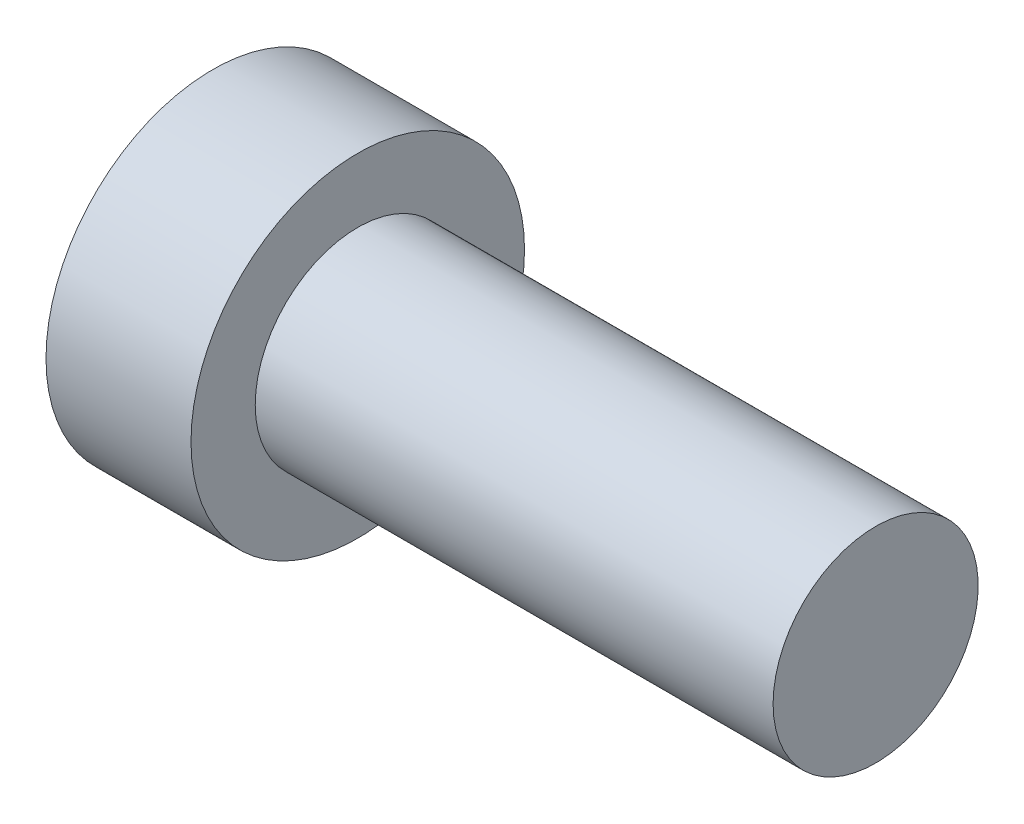
ISO-10303-21;
HEADER;
FILE_DESCRIPTION(('STEP AP214'),'2;1');
FILE_NAME('part.step','',(''),(''),'','','');
FILE_SCHEMA(('AUTOMOTIVE_DESIGN { 1 0 10303 214 1 1 1 1 }'));
ENDSEC;
DATA;
#1=APPLICATION_CONTEXT('core data for automotive mechanical design processes');
#2=APPLICATION_PROTOCOL_DEFINITION('international standard','automotive_design',2000,#1);
#3=PRODUCT_CONTEXT('',#1,'mechanical');
#4=PRODUCT('Part','Part','',(#3));
#5=PRODUCT_RELATED_PRODUCT_CATEGORY('part','',(#4));
#6=PRODUCT_DEFINITION_FORMATION('','',#4);
#7=PRODUCT_DEFINITION_CONTEXT('part definition',#1,'design');
#8=PRODUCT_DEFINITION('design','',#6,#7);
#9=PRODUCT_DEFINITION_SHAPE('','',#8);
#10=(LENGTH_UNIT() NAMED_UNIT(*) SI_UNIT(.MILLI.,.METRE.));
#11=(NAMED_UNIT(*) PLANE_ANGLE_UNIT() SI_UNIT($,.RADIAN.));
#12=(NAMED_UNIT(*) SI_UNIT($,.STERADIAN.) SOLID_ANGLE_UNIT());
#13=UNCERTAINTY_MEASURE_WITH_UNIT(LENGTH_MEASURE(1.E-05),#10,'distance_accuracy_value','');
#14=(GEOMETRIC_REPRESENTATION_CONTEXT(3) GLOBAL_UNCERTAINTY_ASSIGNED_CONTEXT((#13)) GLOBAL_UNIT_ASSIGNED_CONTEXT((#10,
#11,#12)) REPRESENTATION_CONTEXT('',''));
#15=CARTESIAN_POINT('',(0.,0.,0.));
#16=DIRECTION('',(0.,0.,1.));
#17=DIRECTION('',(1.,0.,0.));
#18=AXIS2_PLACEMENT_3D('',#15,#16,#17);
#19=CARTESIAN_POINT('',(3.609467,0.,0.));
#20=DIRECTION('',(-1.,0.,0.));
#21=DIRECTION('',(0.,1.,0.));
#22=AXIS2_PLACEMENT_3D('',#19,#20,#21);
#23=SPHERICAL_SURFACE('',#22,3.609467);
#24=CARTESIAN_POINT('',(0.635,0.,0.));
#25=DIRECTION('',(-1.,0.,0.));
#26=DIRECTION('',(0.,0.,1.));
#27=AXIS2_PLACEMENT_3D('',#24,#25,#26);
#28=CIRCLE('',#27,2.0447);
#29=CARTESIAN_POINT('',(0.635,0.,2.0447));
#30=VERTEX_POINT('',#29);
#31=EDGE_CURVE('E151',#30,#30,#28,.T.);
#32=ORIENTED_EDGE('',*,*,#31,.T.);
#33=EDGE_LOOP('',(#32));
#34=FACE_BOUND('',#33,.T.);
#35=CARTESIAN_POINT('',(3.60739848397723,0.,-0.0205319368186015));
#36=DIRECTION('',(-0.100238850281226,0.,-0.994963402791428));
#37=DIRECTION('',(-0.994963402791428,0.,0.100238850281226));
#38=AXIS2_PLACEMENT_3D('',#35,#36,#37);
#39=CIRCLE('',#38,3.60940801031152);
#40=CARTESIAN_POINT('',(0.266177431910129,1.32316213484822,0.316083616934427));
#41=VERTEX_POINT('',#40);
#42=CARTESIAN_POINT('',(0.0321066751463881,0.339665372280027,0.339665372280028));
#43=VERTEX_POINT('',#42);
#44=EDGE_CURVE('E122',#41,#43,#39,.F.);
#45=ORIENTED_EDGE('',*,*,#44,.T.);
#46=CARTESIAN_POINT('',(3.60739848397723,-0.0205319368186018,0.));
#47=DIRECTION('',(-0.100238850281226,-0.994963402791428,0.));
#48=DIRECTION('',(0.994963402791428,-0.100238850281226,0.));
#49=AXIS2_PLACEMENT_3D('',#46,#47,#48);
#50=CIRCLE('',#49,3.60940801031152);
#51=CARTESIAN_POINT('',(0.266177431910129,0.316083616934423,1.32316213484822));
#52=VERTEX_POINT('',#51);
#53=EDGE_CURVE('E104',#43,#52,#50,.F.);
#54=ORIENTED_EDGE('',*,*,#53,.T.);
#55=CARTESIAN_POINT('',(2.94615805138544,0.,-0.826822317342798));
#56=DIRECTION('',(0.625759286857491,0.,0.78001622733864));
#57=DIRECTION('',(0.78001622733864,0.,-0.625759286857491));
#58=AXIS2_PLACEMENT_3D('',#55,#56,#57);
#59=CIRCLE('',#58,3.45030985830559);
#60=CARTESIAN_POINT('',(0.266177431910128,-0.316083616934432,1.32316213484822));
#61=VERTEX_POINT('',#60);
#62=EDGE_CURVE('E115',#61,#52,#59,.F.);
#63=ORIENTED_EDGE('',*,*,#62,.F.);
#64=CARTESIAN_POINT('',(3.60739848397723,0.0205319368186015,0.));
#65=DIRECTION('',(-0.100238850281226,0.994963402791428,0.));
#66=DIRECTION('',(-0.994963402791428,-0.100238850281226,0.));
#67=AXIS2_PLACEMENT_3D('',#64,#65,#66);
#68=CIRCLE('',#67,3.60940801031152);
#69=CARTESIAN_POINT('',(0.0321066751463881,-0.339665372280029,0.339665372280028));
#70=VERTEX_POINT('',#69);
#71=EDGE_CURVE('E184',#61,#70,#68,.F.);
#72=ORIENTED_EDGE('',*,*,#71,.T.);
#73=CARTESIAN_POINT('',(0.266177431910128,-1.32316213484822,0.316083616934427));
#74=VERTEX_POINT('',#73);
#75=EDGE_CURVE('E159',#70,#74,#39,.F.);
#76=ORIENTED_EDGE('',*,*,#75,.T.);
#77=CARTESIAN_POINT('',(2.94615805138544,0.826822317342798,0.));
#78=DIRECTION('',(0.625759286857491,-0.78001622733864,0.));
#79=DIRECTION('',(0.78001622733864,0.625759286857491,0.));
#80=AXIS2_PLACEMENT_3D('',#77,#78,#79);
#81=CIRCLE('',#80,3.45030985830559);
#82=CARTESIAN_POINT('',(0.266177431910128,-1.32316213484822,-0.316083616934428));
#83=VERTEX_POINT('',#82);
#84=EDGE_CURVE('E157',#83,#74,#81,.F.);
#85=ORIENTED_EDGE('',*,*,#84,.F.);
#86=CARTESIAN_POINT('',(3.60739848397723,0.,0.0205319368186018));
#87=DIRECTION('',(-0.100238850281226,0.,0.994963402791428));
#88=DIRECTION('',(0.994963402791428,0.,0.100238850281226));
#89=AXIS2_PLACEMENT_3D('',#86,#87,#88);
#90=CIRCLE('',#89,3.60940801031152);
#91=CARTESIAN_POINT('',(0.0321066751463881,-0.339665372280027,-0.339665372280028));
#92=VERTEX_POINT('',#91);
#93=EDGE_CURVE('E161',#83,#92,#90,.F.);
#94=ORIENTED_EDGE('',*,*,#93,.T.);
#95=CARTESIAN_POINT('',(0.266177431910128,-0.316083616934422,-1.32316213484822));
#96=VERTEX_POINT('',#95);
#97=EDGE_CURVE('E188',#92,#96,#68,.F.);
#98=ORIENTED_EDGE('',*,*,#97,.T.);
#99=CARTESIAN_POINT('',(2.94615805138544,0.,0.826822317342798));
#100=DIRECTION('',(0.625759286857491,0.,-0.78001622733864));
#101=DIRECTION('',(-0.78001622733864,0.,-0.625759286857491));
#102=AXIS2_PLACEMENT_3D('',#99,#100,#101);
#103=CIRCLE('',#102,3.45030985830559);
#104=CARTESIAN_POINT('',(0.266177431910128,0.316083616934432,-1.32316213484822));
#105=VERTEX_POINT('',#104);
#106=EDGE_CURVE('E116',#105,#96,#103,.F.);
#107=ORIENTED_EDGE('',*,*,#106,.F.);
#108=CARTESIAN_POINT('',(0.0321066751463881,0.339665372280029,-0.339665372280028));
#109=VERTEX_POINT('',#108);
#110=EDGE_CURVE('E141',#105,#109,#50,.F.);
#111=ORIENTED_EDGE('',*,*,#110,.T.);
#112=CARTESIAN_POINT('',(0.266177431910129,1.32316213484822,-0.316083616934428));
#113=VERTEX_POINT('',#112);
#114=EDGE_CURVE('E55',#109,#113,#90,.F.);
#115=ORIENTED_EDGE('',*,*,#114,.T.);
#116=CARTESIAN_POINT('',(2.94615805138544,-0.826822317342798,0.));
#117=DIRECTION('',(0.625759286857491,0.78001622733864,0.));
#118=DIRECTION('',(-0.78001622733864,0.625759286857491,0.));
#119=AXIS2_PLACEMENT_3D('',#116,#117,#118);
#120=CIRCLE('',#119,3.45030985830559);
#121=EDGE_CURVE('E40',#41,#113,#120,.F.);
#122=ORIENTED_EDGE('',*,*,#121,.F.);
#123=EDGE_LOOP('',(#45,#54,#63,#72,#76,#85,#94,#98,#107,#111,#115,#122));
#124=FACE_BOUND('',#123,.T.);
#125=ADVANCED_FACE('F32',(#34,#124),#23,.T.);
#126=CARTESIAN_POINT('',(1.91551441860465,0.,-0.149919069767442));
#127=DIRECTION('',(-0.100238850281226,0.,0.994963402791428));
#128=DIRECTION('',(0.994963402791428,0.,0.100238850281226));
#129=AXIS2_PLACEMENT_3D('',#126,#127,#128);
#130=PLANE('',#129);
#131=ORIENTED_EDGE('',*,*,#114,.F.);
#132=DIRECTION('',(0.990002148884809,-0.099739022462276,0.0997390224622756));
#133=VECTOR('',#132,1.);
#134=CARTESIAN_POINT('',(1.93031770438884,0.148427693960826,-0.148427693960825));
#135=LINE('',#134,#133);
#136=CARTESIAN_POINT('',(1.7018,0.171450000000001,-0.171449999999999));
#137=VERTEX_POINT('',#136);
#138=EDGE_CURVE('E166',#109,#137,#135,.T.);
#139=ORIENTED_EDGE('',*,*,#138,.T.);
#140=DIRECTION('',(0.777618868349576,-0.623836032444622,0.0783421994232783));
#141=VECTOR('',#140,1.);
#142=CARTESIAN_POINT('',(0.,1.5367,-0.3429));
#143=LINE('',#142,#141);
#144=EDGE_CURVE('E125',#113,#137,#143,.T.);
#145=ORIENTED_EDGE('',*,*,#144,.F.);
#146=EDGE_LOOP('',(#131,#139,#145));
#147=FACE_BOUND('',#146,.T.);
#148=ADVANCED_FACE('F165',(#147),#130,.T.);
#149=DIRECTION('',(0.777618868349576,0.623836032444622,0.0783421994232783));
#150=VECTOR('',#149,1.);
#151=CARTESIAN_POINT('',(0.,-1.5367,-0.3429));
#152=LINE('',#151,#150);
#153=CARTESIAN_POINT('',(1.7018,-0.17145,-0.17145));
#154=VERTEX_POINT('',#153);
#155=EDGE_CURVE('E47',#83,#154,#152,.T.);
#156=ORIENTED_EDGE('',*,*,#155,.T.);
#157=DIRECTION('',(-0.990002148884809,-0.0997390224622751,-0.0997390224622757));
#158=VECTOR('',#157,1.);
#159=CARTESIAN_POINT('',(1.93031770438884,-0.148427693960825,-0.148427693960825));
#160=LINE('',#159,#158);
#161=EDGE_CURVE('E186',#154,#92,#160,.T.);
#162=ORIENTED_EDGE('',*,*,#161,.T.);
#163=ORIENTED_EDGE('',*,*,#93,.F.);
#164=EDGE_LOOP('',(#156,#162,#163));
#165=FACE_BOUND('',#164,.T.);
#166=ADVANCED_FACE('F210',(#165),#130,.T.);
#167=CARTESIAN_POINT('',(1.91551441860465,0.,0.149919069767442));
#168=DIRECTION('',(-0.100238850281226,0.,-0.994963402791428));
#169=DIRECTION('',(-0.994963402791428,0.,0.100238850281226));
#170=AXIS2_PLACEMENT_3D('',#167,#168,#169);
#171=PLANE('',#170);
#172=DIRECTION('',(0.777618868349576,-0.623836032444622,-0.0783421994232782));
#173=VECTOR('',#172,1.);
#174=CARTESIAN_POINT('',(0.,1.5367,0.3429));
#175=LINE('',#174,#173);
#176=CARTESIAN_POINT('',(1.7018,0.171449999999999,0.171450000000001));
#177=VERTEX_POINT('',#176);
#178=EDGE_CURVE('E120',#41,#177,#175,.T.);
#179=ORIENTED_EDGE('',*,*,#178,.T.);
#180=DIRECTION('',(-0.990002148884809,0.0997390224622753,0.0997390224622755));
#181=VECTOR('',#180,1.);
#182=CARTESIAN_POINT('',(1.93031770438884,0.148427693960825,0.148427693960825));
#183=LINE('',#182,#181);
#184=EDGE_CURVE('E11',#177,#43,#183,.T.);
#185=ORIENTED_EDGE('',*,*,#184,.T.);
#186=ORIENTED_EDGE('',*,*,#44,.F.);
#187=EDGE_LOOP('',(#179,#185,#186));
#188=FACE_BOUND('',#187,.T.);
#189=ADVANCED_FACE('F121',(#188),#171,.T.);
#190=ORIENTED_EDGE('',*,*,#75,.F.);
#191=DIRECTION('',(0.990002148884809,0.0997390224622758,-0.0997390224622755));
#192=VECTOR('',#191,1.);
#193=CARTESIAN_POINT('',(1.93031770438884,-0.148427693960826,0.148427693960825));
#194=LINE('',#193,#192);
#195=CARTESIAN_POINT('',(1.7018,-0.17145,0.17145));
#196=VERTEX_POINT('',#195);
#197=EDGE_CURVE('E181',#70,#196,#194,.T.);
#198=ORIENTED_EDGE('',*,*,#197,.T.);
#199=DIRECTION('',(0.777618868349576,0.623836032444622,-0.0783421994232781));
#200=VECTOR('',#199,1.);
#201=CARTESIAN_POINT('',(0.,-1.5367,0.3429));
#202=LINE('',#201,#200);
#203=EDGE_CURVE('E172',#74,#196,#202,.T.);
#204=ORIENTED_EDGE('',*,*,#203,.F.);
#205=EDGE_LOOP('',(#190,#198,#204));
#206=FACE_BOUND('',#205,.T.);
#207=ADVANCED_FACE('F180',(#206),#171,.T.);
#208=CARTESIAN_POINT('',(-25.4,0.,0.));
#209=DIRECTION('',(-1.,0.,0.));
#210=DIRECTION('',(0.,0.,1.));
#211=AXIS2_PLACEMENT_3D('',#208,#209,#210);
#212=CYLINDRICAL_SURFACE('',#211,1.2573);
#213=CARTESIAN_POINT('',(8.763,0.,0.));
#214=DIRECTION('',(-1.,0.,0.));
#215=DIRECTION('',(0.,0.,1.));
#216=AXIS2_PLACEMENT_3D('',#213,#214,#215);
#217=CIRCLE('',#216,1.2573);
#218=CARTESIAN_POINT('',(8.763,0.,1.2573));
#219=VERTEX_POINT('',#218);
#220=EDGE_CURVE('E154',#219,#219,#217,.T.);
#221=ORIENTED_EDGE('',*,*,#220,.T.);
#222=EDGE_LOOP('',(#221));
#223=FACE_BOUND('',#222,.T.);
#224=CARTESIAN_POINT('',(2.413,0.,0.));
#225=DIRECTION('',(-1.,0.,0.));
#226=DIRECTION('',(0.,0.,1.));
#227=AXIS2_PLACEMENT_3D('',#224,#225,#226);
#228=CIRCLE('',#227,1.2573);
#229=CARTESIAN_POINT('',(2.413,0.,1.2573));
#230=VERTEX_POINT('',#229);
#231=EDGE_CURVE('E145',#230,#230,#228,.T.);
#232=ORIENTED_EDGE('',*,*,#231,.F.);
#233=EDGE_LOOP('',(#232));
#234=FACE_BOUND('',#233,.T.);
#235=ADVANCED_FACE('F34',(#223,#234),#212,.T.);
#236=CARTESIAN_POINT('',(8.763,1.2573,0.));
#237=DIRECTION('',(1.,0.,0.));
#238=DIRECTION('',(0.,0.,-1.));
#239=AXIS2_PLACEMENT_3D('',#236,#237,#238);
#240=PLANE('',#239);
#241=ORIENTED_EDGE('',*,*,#220,.F.);
#242=EDGE_LOOP('',(#241));
#243=FACE_BOUND('',#242,.T.);
#244=ADVANCED_FACE('F232',(#243),#240,.T.);
#245=CARTESIAN_POINT('',(-25.4,0.,0.));
#246=DIRECTION('',(-1.,0.,0.));
#247=DIRECTION('',(0.,0.,1.));
#248=AXIS2_PLACEMENT_3D('',#245,#246,#247);
#249=CYLINDRICAL_SURFACE('',#248,2.0447);
#250=ORIENTED_EDGE('',*,*,#31,.F.);
#251=EDGE_LOOP('',(#250));
#252=FACE_BOUND('',#251,.T.);
#253=CARTESIAN_POINT('',(2.413,0.,0.));
#254=DIRECTION('',(-1.,0.,0.));
#255=DIRECTION('',(0.,0.,1.));
#256=AXIS2_PLACEMENT_3D('',#253,#254,#255);
#257=CIRCLE('',#256,2.0447);
#258=CARTESIAN_POINT('',(2.413,0.,2.0447));
#259=VERTEX_POINT('',#258);
#260=EDGE_CURVE('E148',#259,#259,#257,.T.);
#261=ORIENTED_EDGE('',*,*,#260,.T.);
#262=EDGE_LOOP('',(#261));
#263=FACE_BOUND('',#262,.T.);
#264=ADVANCED_FACE('F230',(#252,#263),#249,.T.);
#265=CARTESIAN_POINT('',(2.413,1.2573,0.));
#266=DIRECTION('',(-1.,0.,0.));
#267=DIRECTION('',(0.,0.,1.));
#268=AXIS2_PLACEMENT_3D('',#265,#266,#267);
#269=PLANE('',#268);
#270=ORIENTED_EDGE('',*,*,#260,.F.);
#271=EDGE_LOOP('',(#270));
#272=FACE_BOUND('',#271,.T.);
#273=ORIENTED_EDGE('',*,*,#231,.T.);
#274=EDGE_LOOP('',(#273));
#275=FACE_BOUND('',#274,.T.);
#276=ADVANCED_FACE('F239',(#272,#275),#269,.F.);
#277=CARTESIAN_POINT('',(1.7018,0.17145,-0.17145));
#278=DIRECTION('',(-1.,0.,0.));
#279=DIRECTION('',(0.,0.,1.));
#280=AXIS2_PLACEMENT_3D('',#277,#278,#279);
#281=PLANE('',#280);
#282=DIRECTION('',(0.,1.,0.));
#283=VECTOR('',#282,1.);
#284=CARTESIAN_POINT('',(1.7018,-0.17145,-0.17145));
#285=LINE('',#284,#283);
#286=EDGE_CURVE('E138',#154,#137,#285,.T.);
#287=ORIENTED_EDGE('',*,*,#286,.F.);
#288=DIRECTION('',(0.,0.,1.));
#289=VECTOR('',#288,1.);
#290=CARTESIAN_POINT('',(1.7018,-0.17145,-0.17145));
#291=LINE('',#290,#289);
#292=EDGE_CURVE('E133',#154,#196,#291,.T.);
#293=ORIENTED_EDGE('',*,*,#292,.T.);
#294=DIRECTION('',(0.,-1.,0.));
#295=VECTOR('',#294,1.);
#296=CARTESIAN_POINT('',(1.7018,0.17145,0.17145));
#297=LINE('',#296,#295);
#298=EDGE_CURVE('E112',#177,#196,#297,.T.);
#299=ORIENTED_EDGE('',*,*,#298,.F.);
#300=DIRECTION('',(0.,0.,-1.));
#301=VECTOR('',#300,1.);
#302=CARTESIAN_POINT('',(1.7018,0.17145,0.17145));
#303=LINE('',#302,#301);
#304=EDGE_CURVE('E132',#177,#137,#303,.T.);
#305=ORIENTED_EDGE('',*,*,#304,.T.);
#306=EDGE_LOOP('',(#287,#293,#299,#305));
#307=FACE_BOUND('',#306,.T.);
#308=ADVANCED_FACE('F131',(#307),#281,.T.);
#309=CARTESIAN_POINT('',(0.,1.5367,0.3429));
#310=DIRECTION('',(0.625759286857491,0.78001622733864,0.));
#311=DIRECTION('',(-0.78001622733864,0.625759286857491,0.));
#312=AXIS2_PLACEMENT_3D('',#309,#310,#311);
#313=PLANE('',#312);
#314=ORIENTED_EDGE('',*,*,#121,.T.);
#315=ORIENTED_EDGE('',*,*,#144,.T.);
#316=ORIENTED_EDGE('',*,*,#304,.F.);
#317=ORIENTED_EDGE('',*,*,#178,.F.);
#318=EDGE_LOOP('',(#314,#315,#316,#317));
#319=FACE_BOUND('',#318,.T.);
#320=ADVANCED_FACE('F136',(#319),#313,.F.);
#321=CARTESIAN_POINT('',(1.7018,-0.17145,-0.17145));
#322=DIRECTION('',(0.625759286857491,-0.78001622733864,0.));
#323=DIRECTION('',(0.78001622733864,0.625759286857491,0.));
#324=AXIS2_PLACEMENT_3D('',#321,#322,#323);
#325=PLANE('',#324);
#326=ORIENTED_EDGE('',*,*,#84,.T.);
#327=ORIENTED_EDGE('',*,*,#203,.T.);
#328=ORIENTED_EDGE('',*,*,#292,.F.);
#329=ORIENTED_EDGE('',*,*,#155,.F.);
#330=EDGE_LOOP('',(#326,#327,#328,#329));
#331=FACE_BOUND('',#330,.T.);
#332=ADVANCED_FACE('F175',(#331),#325,.F.);
#333=CARTESIAN_POINT('',(1.91551441860465,0.149919069767442,0.));
#334=DIRECTION('',(-0.100238850281226,-0.994963402791428,0.));
#335=DIRECTION('',(0.994963402791428,-0.100238850281226,0.));
#336=AXIS2_PLACEMENT_3D('',#333,#334,#335);
#337=PLANE('',#336);
#338=ORIENTED_EDGE('',*,*,#184,.F.);
#339=DIRECTION('',(0.777618868349576,-0.0783421994232761,-0.623836032444623));
#340=VECTOR('',#339,1.);
#341=CARTESIAN_POINT('',(0.,0.342899999999995,1.5367));
#342=LINE('',#341,#340);
#343=EDGE_CURVE('E102',#52,#177,#342,.T.);
#344=ORIENTED_EDGE('',*,*,#343,.F.);
#345=ORIENTED_EDGE('',*,*,#53,.F.);
#346=EDGE_LOOP('',(#338,#344,#345));
#347=FACE_BOUND('',#346,.T.);
#348=ADVANCED_FACE('F101',(#347),#337,.T.);
#349=CARTESIAN_POINT('',(1.91551441860465,-0.149919069767442,0.));
#350=DIRECTION('',(-0.100238850281226,0.994963402791428,0.));
#351=DIRECTION('',(-0.994963402791428,-0.100238850281226,0.));
#352=AXIS2_PLACEMENT_3D('',#349,#350,#351);
#353=PLANE('',#352);
#354=DIRECTION('',(0.777618868349576,0.0783421994232804,-0.623836032444622));
#355=VECTOR('',#354,1.);
#356=CARTESIAN_POINT('',(0.,-0.342900000000006,1.5367));
#357=LINE('',#356,#355);
#358=EDGE_CURVE('E117',#61,#196,#357,.T.);
#359=ORIENTED_EDGE('',*,*,#358,.T.);
#360=ORIENTED_EDGE('',*,*,#197,.F.);
#361=ORIENTED_EDGE('',*,*,#71,.F.);
#362=EDGE_LOOP('',(#359,#360,#361));
#363=FACE_BOUND('',#362,.T.);
#364=ADVANCED_FACE('F211',(#363),#353,.T.);
#365=CARTESIAN_POINT('',(0.,-0.342900000000006,1.5367));
#366=DIRECTION('',(0.625759286857491,0.,0.78001622733864));
#367=DIRECTION('',(-0.78001622733864,0.,0.625759286857491));
#368=AXIS2_PLACEMENT_3D('',#365,#366,#367);
#369=PLANE('',#368);
#370=ORIENTED_EDGE('',*,*,#62,.T.);
#371=ORIENTED_EDGE('',*,*,#343,.T.);
#372=ORIENTED_EDGE('',*,*,#298,.T.);
#373=ORIENTED_EDGE('',*,*,#358,.F.);
#374=EDGE_LOOP('',(#370,#371,#372,#373));
#375=FACE_BOUND('',#374,.T.);
#376=ADVANCED_FACE('F109',(#375),#369,.F.);
#377=DIRECTION('',(0.777618868349576,-0.0783421994232805,0.623836032444622));
#378=VECTOR('',#377,1.);
#379=CARTESIAN_POINT('',(0.,0.342900000000006,-1.5367));
#380=LINE('',#379,#378);
#381=EDGE_CURVE('E199',#105,#137,#380,.T.);
#382=ORIENTED_EDGE('',*,*,#381,.T.);
#383=ORIENTED_EDGE('',*,*,#138,.F.);
#384=ORIENTED_EDGE('',*,*,#110,.F.);
#385=EDGE_LOOP('',(#382,#383,#384));
#386=FACE_BOUND('',#385,.T.);
#387=ADVANCED_FACE('F198',(#386),#337,.T.);
#388=ORIENTED_EDGE('',*,*,#161,.F.);
#389=DIRECTION('',(0.777618868349576,0.0783421994232759,0.623836032444623));
#390=VECTOR('',#389,1.);
#391=CARTESIAN_POINT('',(0.,-0.342899999999994,-1.5367));
#392=LINE('',#391,#390);
#393=EDGE_CURVE('E203',#96,#154,#392,.T.);
#394=ORIENTED_EDGE('',*,*,#393,.F.);
#395=ORIENTED_EDGE('',*,*,#97,.F.);
#396=EDGE_LOOP('',(#388,#394,#395));
#397=FACE_BOUND('',#396,.T.);
#398=ADVANCED_FACE('F208',(#397),#353,.T.);
#399=CARTESIAN_POINT('',(1.7018,0.171450000000001,-0.171449999999999));
#400=DIRECTION('',(0.625759286857491,0.,-0.78001622733864));
#401=DIRECTION('',(0.78001622733864,0.,0.625759286857491));
#402=AXIS2_PLACEMENT_3D('',#399,#400,#401);
#403=PLANE('',#402);
#404=ORIENTED_EDGE('',*,*,#106,.T.);
#405=ORIENTED_EDGE('',*,*,#393,.T.);
#406=ORIENTED_EDGE('',*,*,#286,.T.);
#407=ORIENTED_EDGE('',*,*,#381,.F.);
#408=EDGE_LOOP('',(#404,#405,#406,#407));
#409=FACE_BOUND('',#408,.T.);
#410=ADVANCED_FACE('F201',(#409),#403,.F.);
#411=CLOSED_SHELL('',(#125,#148,#166,#189,#207,#235,#244,#264,#276,#308,#320,#332,#348,#364,
#376,#387,#398,#410));
#412=MANIFOLD_SOLID_BREP('B2',#411);
#413=ADVANCED_BREP_SHAPE_REPRESENTATION('',(#18,#412),#14);
#414=SHAPE_DEFINITION_REPRESENTATION(#9,#413);
ENDSEC;
END-ISO-10303-21;
